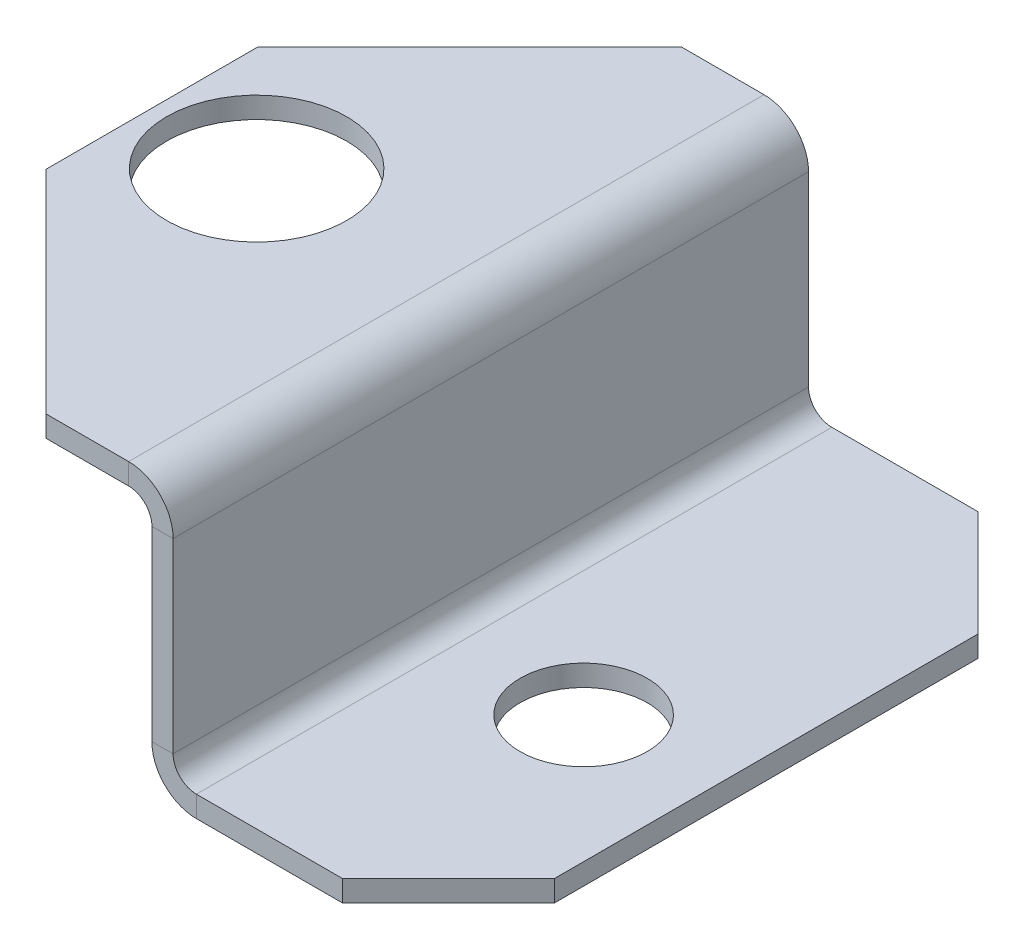
ISO-10303-21;
HEADER;
FILE_DESCRIPTION(('STEP AP214'),'2;1');
FILE_NAME('part.step','',(''),(''),'','','');
FILE_SCHEMA(('AUTOMOTIVE_DESIGN { 1 0 10303 214 1 1 1 1 }'));
ENDSEC;
DATA;
#1=APPLICATION_CONTEXT('core data for automotive mechanical design processes');
#2=APPLICATION_PROTOCOL_DEFINITION('international standard','automotive_design',2000,#1);
#3=PRODUCT_CONTEXT('',#1,'mechanical');
#4=PRODUCT('Part','Part','',(#3));
#5=PRODUCT_RELATED_PRODUCT_CATEGORY('part','',(#4));
#6=PRODUCT_DEFINITION_FORMATION('','',#4);
#7=PRODUCT_DEFINITION_CONTEXT('part definition',#1,'design');
#8=PRODUCT_DEFINITION('design','',#6,#7);
#9=PRODUCT_DEFINITION_SHAPE('','',#8);
#10=(LENGTH_UNIT() NAMED_UNIT(*) SI_UNIT(.MILLI.,.METRE.));
#11=(NAMED_UNIT(*) PLANE_ANGLE_UNIT() SI_UNIT($,.RADIAN.));
#12=(NAMED_UNIT(*) SI_UNIT($,.STERADIAN.) SOLID_ANGLE_UNIT());
#13=UNCERTAINTY_MEASURE_WITH_UNIT(LENGTH_MEASURE(1.E-05),#10,'distance_accuracy_value','');
#14=(GEOMETRIC_REPRESENTATION_CONTEXT(3) GLOBAL_UNCERTAINTY_ASSIGNED_CONTEXT((#13)) GLOBAL_UNIT_ASSIGNED_CONTEXT((#10,
#11,#12)) REPRESENTATION_CONTEXT('',''));
#15=CARTESIAN_POINT('',(0.,0.,0.));
#16=DIRECTION('',(0.,0.,1.));
#17=DIRECTION('',(1.,0.,0.));
#18=AXIS2_PLACEMENT_3D('',#15,#16,#17);
#19=CARTESIAN_POINT('',(1.1,-1.,0.));
#20=DIRECTION('',(0.,0.,-1.));
#21=DIRECTION('',(-1.,0.,0.));
#22=AXIS2_PLACEMENT_3D('',#19,#20,#21);
#23=PLANE('',#22);
#24=DIRECTION('',(0.,-1.,0.));
#25=VECTOR('',#24,1.);
#26=CARTESIAN_POINT('',(-0.999999999999999,12.,0.));
#27=LINE('',#26,#25);
#28=CARTESIAN_POINT('',(-1.,9.9,0.));
#29=VERTEX_POINT('',#28);
#30=CARTESIAN_POINT('',(-1.,1.1,0.));
#31=VERTEX_POINT('',#30);
#32=EDGE_CURVE('E270',#29,#31,#27,.T.);
#33=ORIENTED_EDGE('',*,*,#32,.F.);
#34=DIRECTION('',(1.,0.,0.));
#35=VECTOR('',#34,1.);
#36=CARTESIAN_POINT('',(-1.,9.9,0.));
#37=LINE('',#36,#35);
#38=CARTESIAN_POINT('',(0.,9.9,0.));
#39=VERTEX_POINT('',#38);
#40=EDGE_CURVE('E227',#29,#39,#37,.T.);
#41=ORIENTED_EDGE('',*,*,#40,.T.);
#42=DIRECTION('',(0.,-1.,0.));
#43=VECTOR('',#42,1.);
#44=CARTESIAN_POINT('',(0.,12.,0.));
#45=LINE('',#44,#43);
#46=CARTESIAN_POINT('',(0.,1.1,0.));
#47=VERTEX_POINT('',#46);
#48=EDGE_CURVE('E268',#39,#47,#45,.T.);
#49=ORIENTED_EDGE('',*,*,#48,.T.);
#50=DIRECTION('',(-1.,0.,0.));
#51=VECTOR('',#50,1.);
#52=CARTESIAN_POINT('',(0.,1.1,0.));
#53=LINE('',#52,#51);
#54=EDGE_CURVE('E292',#47,#31,#53,.T.);
#55=ORIENTED_EDGE('',*,*,#54,.T.);
#56=EDGE_LOOP('',(#33,#41,#49,#55));
#57=FACE_BOUND('',#56,.T.);
#58=ADVANCED_FACE('F55',(#57),#23,.T.);
#59=CARTESIAN_POINT('',(0.,12.,30.));
#60=DIRECTION('',(1.,0.,0.));
#61=DIRECTION('',(0.,1.,0.));
#62=AXIS2_PLACEMENT_3D('',#59,#60,#61);
#63=PLANE('',#62);
#64=ORIENTED_EDGE('',*,*,#48,.F.);
#65=DIRECTION('',(0.,0.,-1.));
#66=VECTOR('',#65,1.);
#67=CARTESIAN_POINT('',(0.,9.9,0.));
#68=LINE('',#67,#66);
#69=CARTESIAN_POINT('',(0.,9.9,30.));
#70=VERTEX_POINT('',#69);
#71=EDGE_CURVE('E179',#39,#70,#68,.F.);
#72=ORIENTED_EDGE('',*,*,#71,.T.);
#73=DIRECTION('',(0.,-1.,0.));
#74=VECTOR('',#73,1.);
#75=CARTESIAN_POINT('',(0.,12.,30.));
#76=LINE('',#75,#74);
#77=CARTESIAN_POINT('',(0.,1.1,30.));
#78=VERTEX_POINT('',#77);
#79=EDGE_CURVE('E253',#70,#78,#76,.T.);
#80=ORIENTED_EDGE('',*,*,#79,.T.);
#81=DIRECTION('',(0.,0.,-1.));
#82=VECTOR('',#81,1.);
#83=CARTESIAN_POINT('',(0.,1.1,30.));
#84=LINE('',#83,#82);
#85=EDGE_CURVE('E279',#78,#47,#84,.T.);
#86=ORIENTED_EDGE('',*,*,#85,.T.);
#87=EDGE_LOOP('',(#64,#72,#80,#86));
#88=FACE_BOUND('',#87,.T.);
#89=ADVANCED_FACE('F366',(#88),#63,.T.);
#90=CARTESIAN_POINT('',(-0.999999999999999,12.,30.));
#91=DIRECTION('',(1.,0.,0.));
#92=DIRECTION('',(0.,1.,0.));
#93=AXIS2_PLACEMENT_3D('',#90,#91,#92);
#94=PLANE('',#93);
#95=DIRECTION('',(0.,0.,-1.));
#96=VECTOR('',#95,1.);
#97=CARTESIAN_POINT('',(-1.,9.9,0.));
#98=LINE('',#97,#96);
#99=CARTESIAN_POINT('',(-1.,9.9,30.));
#100=VERTEX_POINT('',#99);
#101=EDGE_CURVE('E231',#29,#100,#98,.F.);
#102=ORIENTED_EDGE('',*,*,#101,.F.);
#103=ORIENTED_EDGE('',*,*,#32,.T.);
#104=DIRECTION('',(0.,0.,-1.));
#105=VECTOR('',#104,1.);
#106=CARTESIAN_POINT('',(-1.,1.1,30.));
#107=LINE('',#106,#105);
#108=CARTESIAN_POINT('',(-1.,1.1,30.));
#109=VERTEX_POINT('',#108);
#110=EDGE_CURVE('E276',#109,#31,#107,.T.);
#111=ORIENTED_EDGE('',*,*,#110,.F.);
#112=DIRECTION('',(0.,-1.,0.));
#113=VECTOR('',#112,1.);
#114=CARTESIAN_POINT('',(-0.999999999999999,12.,30.));
#115=LINE('',#114,#113);
#116=EDGE_CURVE('E255',#100,#109,#115,.T.);
#117=ORIENTED_EDGE('',*,*,#116,.F.);
#118=EDGE_LOOP('',(#102,#103,#111,#117));
#119=FACE_BOUND('',#118,.T.);
#120=ADVANCED_FACE('F372',(#119),#94,.F.);
#121=CARTESIAN_POINT('',(1.1,1.1,30.));
#122=DIRECTION('',(0.,0.,-1.));
#123=DIRECTION('',(-1.,0.,0.));
#124=AXIS2_PLACEMENT_3D('',#121,#122,#123);
#125=PLANE('',#124);
#126=DIRECTION('',(1.,0.,0.));
#127=VECTOR('',#126,1.);
#128=CARTESIAN_POINT('',(-1.,9.9,30.));
#129=LINE('',#128,#127);
#130=EDGE_CURVE('E234',#100,#70,#129,.T.);
#131=ORIENTED_EDGE('',*,*,#130,.F.);
#132=ORIENTED_EDGE('',*,*,#116,.T.);
#133=DIRECTION('',(1.,0.,0.));
#134=VECTOR('',#133,1.);
#135=CARTESIAN_POINT('',(-1.,1.1,30.));
#136=LINE('',#135,#134);
#137=EDGE_CURVE('E295',#109,#78,#136,.T.);
#138=ORIENTED_EDGE('',*,*,#137,.T.);
#139=ORIENTED_EDGE('',*,*,#79,.F.);
#140=EDGE_LOOP('',(#131,#132,#138,#139));
#141=FACE_BOUND('',#140,.T.);
#142=ADVANCED_FACE('F387',(#141),#125,.F.);
#143=CARTESIAN_POINT('',(1.1,0.,30.));
#144=DIRECTION('',(0.,0.,1.));
#145=DIRECTION('',(1.,0.,0.));
#146=AXIS2_PLACEMENT_3D('',#143,#144,#145);
#147=PLANE('',#146);
#148=DIRECTION('',(0.,-1.,0.));
#149=VECTOR('',#148,1.);
#150=CARTESIAN_POINT('',(1.1,0.,30.));
#151=LINE('',#150,#149);
#152=CARTESIAN_POINT('',(1.1,0.,30.));
#153=VERTEX_POINT('',#152);
#154=CARTESIAN_POINT('',(1.1,-1.,30.));
#155=VERTEX_POINT('',#154);
#156=EDGE_CURVE('E298',#153,#155,#151,.T.);
#157=ORIENTED_EDGE('',*,*,#156,.F.);
#158=CARTESIAN_POINT('',(1.1,1.1,30.));
#159=DIRECTION('',(0.,0.,-1.));
#160=DIRECTION('',(-1.,0.,0.));
#161=AXIS2_PLACEMENT_3D('',#158,#159,#160);
#162=CIRCLE('',#161,1.1);
#163=EDGE_CURVE('E250',#78,#153,#162,.F.);
#164=ORIENTED_EDGE('',*,*,#163,.F.);
#165=ORIENTED_EDGE('',*,*,#137,.F.);
#166=CARTESIAN_POINT('',(1.1,1.1,30.));
#167=DIRECTION('',(0.,0.,1.));
#168=DIRECTION('',(1.,0.,0.));
#169=AXIS2_PLACEMENT_3D('',#166,#167,#168);
#170=CIRCLE('',#169,2.1);
#171=EDGE_CURVE('E257',#109,#155,#170,.T.);
#172=ORIENTED_EDGE('',*,*,#171,.T.);
#173=EDGE_LOOP('',(#157,#164,#165,#172));
#174=FACE_BOUND('',#173,.T.);
#175=ADVANCED_FACE('F350',(#174),#147,.T.);
#176=CARTESIAN_POINT('',(-1.,1.1,30.));
#177=DIRECTION('',(0.,0.,1.));
#178=DIRECTION('',(1.,0.,0.));
#179=AXIS2_PLACEMENT_3D('',#176,#177,#178);
#180=PLANE('',#179);
#181=DIRECTION('',(1.,0.,0.));
#182=VECTOR('',#181,1.);
#183=CARTESIAN_POINT('',(0.,-1.,30.));
#184=LINE('',#183,#182);
#185=CARTESIAN_POINT('',(7.99999999999998,-1.,30.));
#186=VERTEX_POINT('',#185);
#187=EDGE_CURVE('E245',#155,#186,#184,.T.);
#188=ORIENTED_EDGE('',*,*,#187,.T.);
#189=DIRECTION('',(0.,1.,0.));
#190=VECTOR('',#189,1.);
#191=CARTESIAN_POINT('',(7.99999999999998,1.1,30.));
#192=LINE('',#191,#190);
#193=CARTESIAN_POINT('',(7.99999999999998,0.,30.));
#194=VERTEX_POINT('',#193);
#195=EDGE_CURVE('E78',#186,#194,#192,.T.);
#196=ORIENTED_EDGE('',*,*,#195,.T.);
#197=DIRECTION('',(1.,0.,0.));
#198=VECTOR('',#197,1.);
#199=CARTESIAN_POINT('',(0.,0.,30.));
#200=LINE('',#199,#198);
#201=EDGE_CURVE('E247',#153,#194,#200,.T.);
#202=ORIENTED_EDGE('',*,*,#201,.F.);
#203=ORIENTED_EDGE('',*,*,#156,.T.);
#204=EDGE_LOOP('',(#188,#196,#202,#203));
#205=FACE_BOUND('',#204,.T.);
#206=ADVANCED_FACE('F344',(#205),#180,.T.);
#207=CARTESIAN_POINT('',(0.,1.1,0.));
#208=DIRECTION('',(0.,0.,-1.));
#209=DIRECTION('',(-1.,0.,0.));
#210=AXIS2_PLACEMENT_3D('',#207,#208,#209);
#211=PLANE('',#210);
#212=ORIENTED_EDGE('',*,*,#54,.F.);
#213=CARTESIAN_POINT('',(1.1,1.1,0.));
#214=DIRECTION('',(0.,0.,-1.));
#215=DIRECTION('',(-1.,0.,0.));
#216=AXIS2_PLACEMENT_3D('',#213,#214,#215);
#217=CIRCLE('',#216,1.1);
#218=CARTESIAN_POINT('',(1.1,0.,0.));
#219=VERTEX_POINT('',#218);
#220=EDGE_CURVE('E265',#47,#219,#217,.F.);
#221=ORIENTED_EDGE('',*,*,#220,.T.);
#222=DIRECTION('',(0.,1.,0.));
#223=VECTOR('',#222,1.);
#224=CARTESIAN_POINT('',(1.1,-1.,0.));
#225=LINE('',#224,#223);
#226=CARTESIAN_POINT('',(1.1,-1.,0.));
#227=VERTEX_POINT('',#226);
#228=EDGE_CURVE('E290',#227,#219,#225,.T.);
#229=ORIENTED_EDGE('',*,*,#228,.F.);
#230=CARTESIAN_POINT('',(1.1,1.1,0.));
#231=DIRECTION('',(0.,0.,1.));
#232=DIRECTION('',(1.,0.,0.));
#233=AXIS2_PLACEMENT_3D('',#230,#231,#232);
#234=CIRCLE('',#233,2.1);
#235=EDGE_CURVE('E248',#31,#227,#234,.T.);
#236=ORIENTED_EDGE('',*,*,#235,.F.);
#237=EDGE_LOOP('',(#212,#221,#229,#236));
#238=FACE_BOUND('',#237,.T.);
#239=ADVANCED_FACE('F379',(#238),#211,.T.);
#240=CARTESIAN_POINT('',(0.,-1.,30.));
#241=DIRECTION('',(0.,1.,0.));
#242=DIRECTION('',(0.,0.,1.));
#243=AXIS2_PLACEMENT_3D('',#240,#241,#242);
#244=PLANE('',#243);
#245=CARTESIAN_POINT('',(7.,-0.999999999999999,17.6186488254214));
#246=DIRECTION('',(0.,1.,0.));
#247=DIRECTION('',(0.,0.,1.));
#248=AXIS2_PLACEMENT_3D('',#245,#246,#247);
#249=CIRCLE('',#248,3.);
#250=CARTESIAN_POINT('',(7.,-0.999999999999999,20.6186488254214));
#251=VERTEX_POINT('',#250);
#252=EDGE_CURVE('E241',#251,#251,#249,.T.);
#253=ORIENTED_EDGE('',*,*,#252,.T.);
#254=EDGE_LOOP('',(#253));
#255=FACE_BOUND('',#254,.T.);
#256=DIRECTION('',(0.,0.,-1.));
#257=VECTOR('',#256,1.);
#258=CARTESIAN_POINT('',(13.,-1.,30.));
#259=LINE('',#258,#257);
#260=CARTESIAN_POINT('',(13.,-1.,25.));
#261=VERTEX_POINT('',#260);
#262=CARTESIAN_POINT('',(13.,-1.,5.00000000000002));
#263=VERTEX_POINT('',#262);
#264=EDGE_CURVE('E287',#261,#263,#259,.T.);
#265=ORIENTED_EDGE('',*,*,#264,.F.);
#266=DIRECTION('',(0.707106781186549,0.,-0.707106781186546));
#267=VECTOR('',#266,1.);
#268=CARTESIAN_POINT('',(13.,-1.,25.));
#269=LINE('',#268,#267);
#270=EDGE_CURVE('E327',#261,#186,#269,.F.);
#271=ORIENTED_EDGE('',*,*,#270,.T.);
#272=ORIENTED_EDGE('',*,*,#187,.F.);
#273=DIRECTION('',(0.,0.,-1.));
#274=VECTOR('',#273,1.);
#275=CARTESIAN_POINT('',(1.1,-1.,30.));
#276=LINE('',#275,#274);
#277=EDGE_CURVE('E260',#155,#227,#276,.T.);
#278=ORIENTED_EDGE('',*,*,#277,.T.);
#279=DIRECTION('',(1.,0.,0.));
#280=VECTOR('',#279,1.);
#281=CARTESIAN_POINT('',(0.,-1.,0.));
#282=LINE('',#281,#280);
#283=CARTESIAN_POINT('',(7.99999999999999,-1.,0.));
#284=VERTEX_POINT('',#283);
#285=EDGE_CURVE('E244',#227,#284,#282,.T.);
#286=ORIENTED_EDGE('',*,*,#285,.T.);
#287=DIRECTION('',(-0.707106781186546,0.,-0.707106781186549));
#288=VECTOR('',#287,1.);
#289=CARTESIAN_POINT('',(7.99999999999999,-1.,0.));
#290=LINE('',#289,#288);
#291=EDGE_CURVE('E325',#284,#263,#290,.F.);
#292=ORIENTED_EDGE('',*,*,#291,.T.);
#293=EDGE_LOOP('',(#265,#271,#272,#278,#286,#292));
#294=FACE_BOUND('',#293,.T.);
#295=ADVANCED_FACE('F343',(#255,#294),#244,.F.);
#296=CARTESIAN_POINT('',(13.,0.,30.));
#297=DIRECTION('',(1.,0.,0.));
#298=DIRECTION('',(0.,0.,-1.));
#299=AXIS2_PLACEMENT_3D('',#296,#297,#298);
#300=PLANE('',#299);
#301=DIRECTION('',(0.,0.,-1.));
#302=VECTOR('',#301,1.);
#303=CARTESIAN_POINT('',(13.,0.,30.));
#304=LINE('',#303,#302);
#305=CARTESIAN_POINT('',(13.,0.,25.));
#306=VERTEX_POINT('',#305);
#307=CARTESIAN_POINT('',(13.,0.,5.00000000000003));
#308=VERTEX_POINT('',#307);
#309=EDGE_CURVE('E285',#306,#308,#304,.T.);
#310=ORIENTED_EDGE('',*,*,#309,.F.);
#311=DIRECTION('',(0.,-1.,0.));
#312=VECTOR('',#311,1.);
#313=CARTESIAN_POINT('',(13.,0.,25.));
#314=LINE('',#313,#312);
#315=EDGE_CURVE('E322',#306,#261,#314,.T.);
#316=ORIENTED_EDGE('',*,*,#315,.T.);
#317=ORIENTED_EDGE('',*,*,#264,.T.);
#318=DIRECTION('',(0.,1.,0.));
#319=VECTOR('',#318,1.);
#320=CARTESIAN_POINT('',(13.,0.,5.00000000000002));
#321=LINE('',#320,#319);
#322=EDGE_CURVE('E317',#263,#308,#321,.T.);
#323=ORIENTED_EDGE('',*,*,#322,.T.);
#324=EDGE_LOOP('',(#310,#316,#317,#323));
#325=FACE_BOUND('',#324,.T.);
#326=ADVANCED_FACE('F337',(#325),#300,.T.);
#327=CARTESIAN_POINT('',(0.,0.,30.));
#328=DIRECTION('',(0.,1.,0.));
#329=DIRECTION('',(0.,0.,1.));
#330=AXIS2_PLACEMENT_3D('',#327,#328,#329);
#331=PLANE('',#330);
#332=CARTESIAN_POINT('',(7.,0.,17.6186488254214));
#333=DIRECTION('',(0.,1.,0.));
#334=DIRECTION('',(0.,0.,1.));
#335=AXIS2_PLACEMENT_3D('',#332,#333,#334);
#336=CIRCLE('',#335,3.);
#337=CARTESIAN_POINT('',(7.,0.,20.6186488254214));
#338=VERTEX_POINT('',#337);
#339=EDGE_CURVE('E237',#338,#338,#336,.T.);
#340=ORIENTED_EDGE('',*,*,#339,.F.);
#341=EDGE_LOOP('',(#340));
#342=FACE_BOUND('',#341,.T.);
#343=ORIENTED_EDGE('',*,*,#201,.T.);
#344=DIRECTION('',(-0.707106781186549,0.,0.707106781186546));
#345=VECTOR('',#344,1.);
#346=CARTESIAN_POINT('',(3.99999999999998,0.,34.));
#347=LINE('',#346,#345);
#348=EDGE_CURVE('E63',#194,#306,#347,.F.);
#349=ORIENTED_EDGE('',*,*,#348,.T.);
#350=ORIENTED_EDGE('',*,*,#309,.T.);
#351=DIRECTION('',(0.707106781186546,0.,0.707106781186549));
#352=VECTOR('',#351,1.);
#353=CARTESIAN_POINT('',(19.,0.,11.0000000000001));
#354=LINE('',#353,#352);
#355=CARTESIAN_POINT('',(7.99999999999998,0.,0.));
#356=VERTEX_POINT('',#355);
#357=EDGE_CURVE('E70',#308,#356,#354,.F.);
#358=ORIENTED_EDGE('',*,*,#357,.T.);
#359=DIRECTION('',(1.,0.,0.));
#360=VECTOR('',#359,1.);
#361=CARTESIAN_POINT('',(0.,0.,0.));
#362=LINE('',#361,#360);
#363=EDGE_CURVE('E263',#219,#356,#362,.T.);
#364=ORIENTED_EDGE('',*,*,#363,.F.);
#365=DIRECTION('',(0.,0.,-1.));
#366=VECTOR('',#365,1.);
#367=CARTESIAN_POINT('',(1.1,0.,30.));
#368=LINE('',#367,#366);
#369=EDGE_CURVE('E282',#153,#219,#368,.T.);
#370=ORIENTED_EDGE('',*,*,#369,.F.);
#371=EDGE_LOOP('',(#343,#349,#350,#358,#364,#370));
#372=FACE_BOUND('',#371,.T.);
#373=ADVANCED_FACE('F332',(#342,#372),#331,.T.);
#374=CARTESIAN_POINT('',(1.1,1.1,30.));
#375=DIRECTION('',(0.,0.,-1.));
#376=DIRECTION('',(-1.,0.,0.));
#377=AXIS2_PLACEMENT_3D('',#374,#375,#376);
#378=CYLINDRICAL_SURFACE('',#377,1.1);
#379=ORIENTED_EDGE('',*,*,#220,.F.);
#380=ORIENTED_EDGE('',*,*,#85,.F.);
#381=ORIENTED_EDGE('',*,*,#163,.T.);
#382=ORIENTED_EDGE('',*,*,#369,.T.);
#383=EDGE_LOOP('',(#379,#380,#381,#382));
#384=FACE_BOUND('',#383,.T.);
#385=ADVANCED_FACE('F455',(#384),#378,.F.);
#386=CARTESIAN_POINT('',(1.1,1.1,30.));
#387=DIRECTION('',(0.,0.,-1.));
#388=DIRECTION('',(-1.,0.,0.));
#389=AXIS2_PLACEMENT_3D('',#386,#387,#388);
#390=CYLINDRICAL_SURFACE('',#389,2.1);
#391=ORIENTED_EDGE('',*,*,#235,.T.);
#392=ORIENTED_EDGE('',*,*,#277,.F.);
#393=ORIENTED_EDGE('',*,*,#171,.F.);
#394=ORIENTED_EDGE('',*,*,#110,.T.);
#395=EDGE_LOOP('',(#391,#392,#393,#394));
#396=FACE_BOUND('',#395,.T.);
#397=ADVANCED_FACE('F353',(#396),#390,.T.);
#398=CARTESIAN_POINT('',(1.1,1.1,0.));
#399=DIRECTION('',(0.,0.,-1.));
#400=DIRECTION('',(-1.,0.,0.));
#401=AXIS2_PLACEMENT_3D('',#398,#399,#400);
#402=PLANE('',#401);
#403=ORIENTED_EDGE('',*,*,#363,.T.);
#404=DIRECTION('',(0.,-1.,0.));
#405=VECTOR('',#404,1.);
#406=CARTESIAN_POINT('',(7.99999999999999,1.1,0.));
#407=LINE('',#406,#405);
#408=EDGE_CURVE('E13',#356,#284,#407,.T.);
#409=ORIENTED_EDGE('',*,*,#408,.T.);
#410=ORIENTED_EDGE('',*,*,#285,.F.);
#411=ORIENTED_EDGE('',*,*,#228,.T.);
#412=EDGE_LOOP('',(#403,#409,#410,#411));
#413=FACE_BOUND('',#412,.T.);
#414=ADVANCED_FACE('F357',(#413),#402,.T.);
#415=CARTESIAN_POINT('',(7.,-10.,17.6186488254214));
#416=DIRECTION('',(0.,1.,0.));
#417=DIRECTION('',(0.,0.,1.));
#418=AXIS2_PLACEMENT_3D('',#415,#416,#417);
#419=CYLINDRICAL_SURFACE('',#418,3.);
#420=ORIENTED_EDGE('',*,*,#339,.T.);
#421=EDGE_LOOP('',(#420));
#422=FACE_BOUND('',#421,.T.);
#423=ORIENTED_EDGE('',*,*,#252,.F.);
#424=EDGE_LOOP('',(#423));
#425=FACE_BOUND('',#424,.T.);
#426=ADVANCED_FACE('F441',(#422,#425),#419,.F.);
#427=CARTESIAN_POINT('',(-2.1,9.9,30.));
#428=DIRECTION('',(0.,0.,1.));
#429=DIRECTION('',(1.,0.,0.));
#430=AXIS2_PLACEMENT_3D('',#427,#428,#429);
#431=PLANE('',#430);
#432=DIRECTION('',(0.,-1.,0.));
#433=VECTOR('',#432,1.);
#434=CARTESIAN_POINT('',(-2.09999999999999,12.,30.));
#435=LINE('',#434,#433);
#436=CARTESIAN_POINT('',(-2.1,11.,30.));
#437=VERTEX_POINT('',#436);
#438=CARTESIAN_POINT('',(-2.09999999999999,12.,30.));
#439=VERTEX_POINT('',#438);
#440=EDGE_CURVE('E221',#437,#439,#435,.F.);
#441=ORIENTED_EDGE('',*,*,#440,.F.);
#442=CARTESIAN_POINT('',(-2.1,9.9,30.));
#443=DIRECTION('',(0.,0.,-1.));
#444=DIRECTION('',(-1.,0.,0.));
#445=AXIS2_PLACEMENT_3D('',#442,#443,#444);
#446=CIRCLE('',#445,1.1);
#447=EDGE_CURVE('E182',#100,#437,#446,.F.);
#448=ORIENTED_EDGE('',*,*,#447,.F.);
#449=ORIENTED_EDGE('',*,*,#130,.T.);
#450=CARTESIAN_POINT('',(-2.1,9.9,30.));
#451=DIRECTION('',(0.,0.,-1.));
#452=DIRECTION('',(-1.,0.,0.));
#453=AXIS2_PLACEMENT_3D('',#450,#451,#452);
#454=CIRCLE('',#453,2.1);
#455=EDGE_CURVE('E226',#70,#439,#454,.F.);
#456=ORIENTED_EDGE('',*,*,#455,.T.);
#457=EDGE_LOOP('',(#441,#448,#449,#456));
#458=FACE_BOUND('',#457,.T.);
#459=ADVANCED_FACE('F438',(#458),#431,.T.);
#460=CARTESIAN_POINT('',(-2.1,9.9,0.));
#461=DIRECTION('',(0.,0.,1.));
#462=DIRECTION('',(1.,0.,0.));
#463=AXIS2_PLACEMENT_3D('',#460,#461,#462);
#464=PLANE('',#463);
#465=CARTESIAN_POINT('',(-2.1,9.9,0.));
#466=DIRECTION('',(0.,0.,-1.));
#467=DIRECTION('',(-1.,0.,0.));
#468=AXIS2_PLACEMENT_3D('',#465,#466,#467);
#469=CIRCLE('',#468,1.1);
#470=CARTESIAN_POINT('',(-2.1,11.,0.));
#471=VERTEX_POINT('',#470);
#472=EDGE_CURVE('E189',#471,#29,#469,.T.);
#473=ORIENTED_EDGE('',*,*,#472,.F.);
#474=DIRECTION('',(0.,-1.,0.));
#475=VECTOR('',#474,1.);
#476=CARTESIAN_POINT('',(-2.1,11.,0.));
#477=LINE('',#476,#475);
#478=CARTESIAN_POINT('',(-2.09999999999999,12.,0.));
#479=VERTEX_POINT('',#478);
#480=EDGE_CURVE('E186',#471,#479,#477,.F.);
#481=ORIENTED_EDGE('',*,*,#480,.T.);
#482=CARTESIAN_POINT('',(-2.1,9.9,0.));
#483=DIRECTION('',(0.,0.,-1.));
#484=DIRECTION('',(-1.,0.,0.));
#485=AXIS2_PLACEMENT_3D('',#482,#483,#484);
#486=CIRCLE('',#485,2.1);
#487=EDGE_CURVE('E172',#479,#39,#486,.T.);
#488=ORIENTED_EDGE('',*,*,#487,.T.);
#489=ORIENTED_EDGE('',*,*,#40,.F.);
#490=EDGE_LOOP('',(#473,#481,#488,#489));
#491=FACE_BOUND('',#490,.T.);
#492=ADVANCED_FACE('F187',(#491),#464,.F.);
#493=CARTESIAN_POINT('',(-2.1,9.9,0.));
#494=DIRECTION('',(0.,0.,-1.));
#495=DIRECTION('',(0.,1.,0.));
#496=AXIS2_PLACEMENT_3D('',#493,#494,#495);
#497=CYLINDRICAL_SURFACE('',#496,2.1);
#498=ORIENTED_EDGE('',*,*,#71,.F.);
#499=ORIENTED_EDGE('',*,*,#487,.F.);
#500=DIRECTION('',(0.,0.,-1.));
#501=VECTOR('',#500,1.);
#502=CARTESIAN_POINT('',(-2.09999999999999,12.,30.));
#503=LINE('',#502,#501);
#504=EDGE_CURVE('E176',#479,#439,#503,.F.);
#505=ORIENTED_EDGE('',*,*,#504,.T.);
#506=ORIENTED_EDGE('',*,*,#455,.F.);
#507=EDGE_LOOP('',(#498,#499,#505,#506));
#508=FACE_BOUND('',#507,.T.);
#509=ADVANCED_FACE('F174',(#508),#497,.T.);
#510=CARTESIAN_POINT('',(-2.1,9.9,0.));
#511=DIRECTION('',(0.,0.,-1.));
#512=DIRECTION('',(0.,1.,0.));
#513=AXIS2_PLACEMENT_3D('',#510,#511,#512);
#514=CYLINDRICAL_SURFACE('',#513,1.1);
#515=ORIENTED_EDGE('',*,*,#101,.T.);
#516=ORIENTED_EDGE('',*,*,#447,.T.);
#517=DIRECTION('',(0.,0.,-1.));
#518=VECTOR('',#517,1.);
#519=CARTESIAN_POINT('',(-2.1,11.,30.));
#520=LINE('',#519,#518);
#521=EDGE_CURVE('E194',#437,#471,#520,.T.);
#522=ORIENTED_EDGE('',*,*,#521,.T.);
#523=ORIENTED_EDGE('',*,*,#472,.T.);
#524=EDGE_LOOP('',(#515,#516,#522,#523));
#525=FACE_BOUND('',#524,.T.);
#526=ADVANCED_FACE('F432',(#525),#514,.F.);
#527=CARTESIAN_POINT('',(-16.,12.0000000000001,0.));
#528=DIRECTION('',(0.,0.,1.));
#529=DIRECTION('',(1.,0.,0.));
#530=AXIS2_PLACEMENT_3D('',#527,#528,#529);
#531=PLANE('',#530);
#532=DIRECTION('',(1.,0.,0.));
#533=VECTOR('',#532,1.);
#534=CARTESIAN_POINT('',(-16.,11.0000000000001,0.));
#535=LINE('',#534,#533);
#536=CARTESIAN_POINT('',(-5.99999999999997,11.,0.));
#537=VERTEX_POINT('',#536);
#538=EDGE_CURVE('E204',#471,#537,#535,.F.);
#539=ORIENTED_EDGE('',*,*,#538,.T.);
#540=DIRECTION('',(0.,1.,0.));
#541=VECTOR('',#540,1.);
#542=CARTESIAN_POINT('',(-5.99999999999997,12.,0.));
#543=LINE('',#542,#541);
#544=CARTESIAN_POINT('',(-5.99999999999997,12.,0.));
#545=VERTEX_POINT('',#544);
#546=EDGE_CURVE('E208',#537,#545,#543,.T.);
#547=ORIENTED_EDGE('',*,*,#546,.T.);
#548=DIRECTION('',(-1.,0.,0.));
#549=VECTOR('',#548,1.);
#550=CARTESIAN_POINT('',(-0.999999999999999,12.,0.));
#551=LINE('',#550,#549);
#552=EDGE_CURVE('E200',#479,#545,#551,.T.);
#553=ORIENTED_EDGE('',*,*,#552,.F.);
#554=ORIENTED_EDGE('',*,*,#480,.F.);
#555=EDGE_LOOP('',(#539,#547,#553,#554));
#556=FACE_BOUND('',#555,.T.);
#557=ADVANCED_FACE('F206',(#556),#531,.F.);
#558=CARTESIAN_POINT('',(-0.999999999999996,12.,30.));
#559=DIRECTION('',(0.,0.,-1.));
#560=DIRECTION('',(-1.,0.,0.));
#561=AXIS2_PLACEMENT_3D('',#558,#559,#560);
#562=PLANE('',#561);
#563=DIRECTION('',(1.,0.,0.));
#564=VECTOR('',#563,1.);
#565=CARTESIAN_POINT('',(-0.999999999999999,12.,30.));
#566=LINE('',#565,#564);
#567=CARTESIAN_POINT('',(-5.99999999999999,12.,30.));
#568=VERTEX_POINT('',#567);
#569=EDGE_CURVE('E203',#568,#439,#566,.T.);
#570=ORIENTED_EDGE('',*,*,#569,.F.);
#571=DIRECTION('',(0.,-1.,0.));
#572=VECTOR('',#571,1.);
#573=CARTESIAN_POINT('',(-5.99999999999999,12.,30.));
#574=LINE('',#573,#572);
#575=CARTESIAN_POINT('',(-5.99999999999998,11.,30.));
#576=VERTEX_POINT('',#575);
#577=EDGE_CURVE('E300',#568,#576,#574,.T.);
#578=ORIENTED_EDGE('',*,*,#577,.T.);
#579=DIRECTION('',(-1.,0.,0.));
#580=VECTOR('',#579,1.);
#581=CARTESIAN_POINT('',(-1.,11.,30.));
#582=LINE('',#581,#580);
#583=EDGE_CURVE('E210',#576,#437,#582,.F.);
#584=ORIENTED_EDGE('',*,*,#583,.T.);
#585=ORIENTED_EDGE('',*,*,#440,.T.);
#586=EDGE_LOOP('',(#570,#578,#584,#585));
#587=FACE_BOUND('',#586,.T.);
#588=ADVANCED_FACE('F409',(#587),#562,.F.);
#589=CARTESIAN_POINT('',(-0.999999999999999,12.,0.));
#590=DIRECTION('',(0.,-1.,0.));
#591=DIRECTION('',(1.,0.,0.));
#592=AXIS2_PLACEMENT_3D('',#589,#590,#591);
#593=PLANE('',#592);
#594=CARTESIAN_POINT('',(-11.0546245136049,12.,15.));
#595=DIRECTION('',(0.,1.,0.));
#596=DIRECTION('',(-1.,0.,0.));
#597=AXIS2_PLACEMENT_3D('',#594,#595,#596);
#598=CIRCLE('',#597,4.25);
#599=CARTESIAN_POINT('',(-15.3046245136049,12.,15.));
#600=VERTEX_POINT('',#599);
#601=EDGE_CURVE('E320',#600,#600,#598,.T.);
#602=ORIENTED_EDGE('',*,*,#601,.F.);
#603=EDGE_LOOP('',(#602));
#604=FACE_BOUND('',#603,.T.);
#605=DIRECTION('',(0.,0.,1.));
#606=VECTOR('',#605,1.);
#607=CARTESIAN_POINT('',(-16.,12.0000000000001,0.));
#608=LINE('',#607,#606);
#609=CARTESIAN_POINT('',(-16.,12.0000000000001,9.99999999999999));
#610=VERTEX_POINT('',#609);
#611=CARTESIAN_POINT('',(-16.,12.0000000000001,19.9999999999999));
#612=VERTEX_POINT('',#611);
#613=EDGE_CURVE('E209',#610,#612,#608,.T.);
#614=ORIENTED_EDGE('',*,*,#613,.T.);
#615=DIRECTION('',(-0.707106781186546,0.,-0.707106781186549));
#616=VECTOR('',#615,1.);
#617=CARTESIAN_POINT('',(-5.99999999999999,12.,30.));
#618=LINE('',#617,#616);
#619=EDGE_CURVE('E314',#612,#568,#618,.F.);
#620=ORIENTED_EDGE('',*,*,#619,.T.);
#621=ORIENTED_EDGE('',*,*,#569,.T.);
#622=ORIENTED_EDGE('',*,*,#504,.F.);
#623=ORIENTED_EDGE('',*,*,#552,.T.);
#624=DIRECTION('',(0.707106781186549,0.,-0.707106781186546));
#625=VECTOR('',#624,1.);
#626=CARTESIAN_POINT('',(-16.,12.0000000000001,9.99999999999999));
#627=LINE('',#626,#625);
#628=EDGE_CURVE('E312',#545,#610,#627,.F.);
#629=ORIENTED_EDGE('',*,*,#628,.T.);
#630=EDGE_LOOP('',(#614,#620,#621,#622,#623,#629));
#631=FACE_BOUND('',#630,.T.);
#632=ADVANCED_FACE('F199',(#604,#631),#593,.F.);
#633=CARTESIAN_POINT('',(-1.,11.,0.));
#634=DIRECTION('',(0.,-1.,0.));
#635=DIRECTION('',(1.,0.,0.));
#636=AXIS2_PLACEMENT_3D('',#633,#634,#635);
#637=PLANE('',#636);
#638=CARTESIAN_POINT('',(-11.0546245136049,11.,15.));
#639=DIRECTION('',(0.,-1.,0.));
#640=DIRECTION('',(1.,0.,0.));
#641=AXIS2_PLACEMENT_3D('',#638,#639,#640);
#642=CIRCLE('',#641,4.25);
#643=CARTESIAN_POINT('',(-6.80462451360491,11.,15.));
#644=VERTEX_POINT('',#643);
#645=EDGE_CURVE('E224',#644,#644,#642,.T.);
#646=ORIENTED_EDGE('',*,*,#645,.F.);
#647=EDGE_LOOP('',(#646));
#648=FACE_BOUND('',#647,.T.);
#649=ORIENTED_EDGE('',*,*,#583,.F.);
#650=DIRECTION('',(0.707106781186546,0.,0.707106781186549));
#651=VECTOR('',#650,1.);
#652=CARTESIAN_POINT('',(-18.5,11.0000000000001,17.4999999999999));
#653=LINE('',#652,#651);
#654=CARTESIAN_POINT('',(-16.,11.0000000000001,20.));
#655=VERTEX_POINT('',#654);
#656=EDGE_CURVE('E305',#576,#655,#653,.F.);
#657=ORIENTED_EDGE('',*,*,#656,.T.);
#658=DIRECTION('',(0.,0.,-1.));
#659=VECTOR('',#658,1.);
#660=CARTESIAN_POINT('',(-16.,11.0000000000001,30.));
#661=LINE('',#660,#659);
#662=CARTESIAN_POINT('',(-16.,11.0000000000001,9.99999999999999));
#663=VERTEX_POINT('',#662);
#664=EDGE_CURVE('E213',#663,#655,#661,.F.);
#665=ORIENTED_EDGE('',*,*,#664,.F.);
#666=DIRECTION('',(-0.707106781186549,0.,0.707106781186546));
#667=VECTOR('',#666,1.);
#668=CARTESIAN_POINT('',(-3.49999999999998,11.,-2.49999999999999));
#669=LINE('',#668,#667);
#670=EDGE_CURVE('E303',#663,#537,#669,.F.);
#671=ORIENTED_EDGE('',*,*,#670,.T.);
#672=ORIENTED_EDGE('',*,*,#538,.F.);
#673=ORIENTED_EDGE('',*,*,#521,.F.);
#674=EDGE_LOOP('',(#649,#657,#665,#671,#672,#673));
#675=FACE_BOUND('',#674,.T.);
#676=ADVANCED_FACE('F418',(#648,#675),#637,.T.);
#677=CARTESIAN_POINT('',(-16.,12.0000000000001,30.));
#678=DIRECTION('',(1.,0.,0.));
#679=DIRECTION('',(0.,1.,0.));
#680=AXIS2_PLACEMENT_3D('',#677,#678,#679);
#681=PLANE('',#680);
#682=ORIENTED_EDGE('',*,*,#664,.T.);
#683=DIRECTION('',(0.,1.,0.));
#684=VECTOR('',#683,1.);
#685=CARTESIAN_POINT('',(-16.,12.0000000000001,20.));
#686=LINE('',#685,#684);
#687=EDGE_CURVE('E310',#655,#612,#686,.T.);
#688=ORIENTED_EDGE('',*,*,#687,.T.);
#689=ORIENTED_EDGE('',*,*,#613,.F.);
#690=DIRECTION('',(0.,-1.,0.));
#691=VECTOR('',#690,1.);
#692=CARTESIAN_POINT('',(-16.,12.0000000000001,9.99999999999999));
#693=LINE('',#692,#691);
#694=EDGE_CURVE('E307',#610,#663,#693,.T.);
#695=ORIENTED_EDGE('',*,*,#694,.T.);
#696=EDGE_LOOP('',(#682,#688,#689,#695));
#697=FACE_BOUND('',#696,.T.);
#698=ADVANCED_FACE('F392',(#697),#681,.F.);
#699=CARTESIAN_POINT('',(-5.99999999999999,12.,30.));
#700=DIRECTION('',(0.707106781186549,0.,-0.707106781186546));
#701=DIRECTION('',(-0.707106781186546,0.,-0.707106781186549));
#702=AXIS2_PLACEMENT_3D('',#699,#700,#701);
#703=PLANE('',#702);
#704=ORIENTED_EDGE('',*,*,#619,.F.);
#705=ORIENTED_EDGE('',*,*,#687,.F.);
#706=ORIENTED_EDGE('',*,*,#656,.F.);
#707=ORIENTED_EDGE('',*,*,#577,.F.);
#708=EDGE_LOOP('',(#704,#705,#706,#707));
#709=FACE_BOUND('',#708,.T.);
#710=ADVANCED_FACE('F388',(#709),#703,.F.);
#711=CARTESIAN_POINT('',(-16.,12.0000000000001,9.99999999999999));
#712=DIRECTION('',(0.707106781186546,0.,0.707106781186549));
#713=DIRECTION('',(0.707106781186549,0.,-0.707106781186546));
#714=AXIS2_PLACEMENT_3D('',#711,#712,#713);
#715=PLANE('',#714);
#716=ORIENTED_EDGE('',*,*,#628,.F.);
#717=ORIENTED_EDGE('',*,*,#546,.F.);
#718=ORIENTED_EDGE('',*,*,#670,.F.);
#719=ORIENTED_EDGE('',*,*,#694,.F.);
#720=EDGE_LOOP('',(#716,#717,#718,#719));
#721=FACE_BOUND('',#720,.T.);
#722=ADVANCED_FACE('F391',(#721),#715,.F.);
#723=CARTESIAN_POINT('',(-11.0546245136049,2.00000000000003,15.));
#724=DIRECTION('',(0.,1.,0.));
#725=DIRECTION('',(-1.,0.,0.));
#726=AXIS2_PLACEMENT_3D('',#723,#724,#725);
#727=CYLINDRICAL_SURFACE('',#726,4.25);
#728=ORIENTED_EDGE('',*,*,#645,.T.);
#729=EDGE_LOOP('',(#728));
#730=FACE_BOUND('',#729,.T.);
#731=ORIENTED_EDGE('',*,*,#601,.T.);
#732=EDGE_LOOP('',(#731));
#733=FACE_BOUND('',#732,.T.);
#734=ADVANCED_FACE('F364',(#730,#733),#727,.F.);
#735=CARTESIAN_POINT('',(13.,0.,25.));
#736=DIRECTION('',(-0.707106781186546,0.,-0.707106781186549));
#737=DIRECTION('',(-0.707106781186549,0.,0.707106781186546));
#738=AXIS2_PLACEMENT_3D('',#735,#736,#737);
#739=PLANE('',#738);
#740=ORIENTED_EDGE('',*,*,#348,.F.);
#741=ORIENTED_EDGE('',*,*,#195,.F.);
#742=ORIENTED_EDGE('',*,*,#270,.F.);
#743=ORIENTED_EDGE('',*,*,#315,.F.);
#744=EDGE_LOOP('',(#740,#741,#742,#743));
#745=FACE_BOUND('',#744,.T.);
#746=ADVANCED_FACE('F340',(#745),#739,.F.);
#747=CARTESIAN_POINT('',(7.99999999999999,1.1,0.));
#748=DIRECTION('',(-0.707106781186549,0.,0.707106781186546));
#749=DIRECTION('',(0.707106781186546,0.,0.707106781186549));
#750=AXIS2_PLACEMENT_3D('',#747,#748,#749);
#751=PLANE('',#750);
#752=ORIENTED_EDGE('',*,*,#357,.F.);
#753=ORIENTED_EDGE('',*,*,#322,.F.);
#754=ORIENTED_EDGE('',*,*,#291,.F.);
#755=ORIENTED_EDGE('',*,*,#408,.F.);
#756=EDGE_LOOP('',(#752,#753,#754,#755));
#757=FACE_BOUND('',#756,.T.);
#758=ADVANCED_FACE('F57',(#757),#751,.F.);
#759=CLOSED_SHELL('',(#58,#89,#120,#142,#175,#206,#239,#295,#326,#373,#385,#397,#414,#426,#459,
#492,#509,#526,#557,#588,#632,#676,#698,#710,#722,#734,#746,#758));
#760=MANIFOLD_SOLID_BREP('B2',#759);
#761=ADVANCED_BREP_SHAPE_REPRESENTATION('',(#18,#760),#14);
#762=SHAPE_DEFINITION_REPRESENTATION(#9,#761);
ENDSEC;
END-ISO-10303-21;
